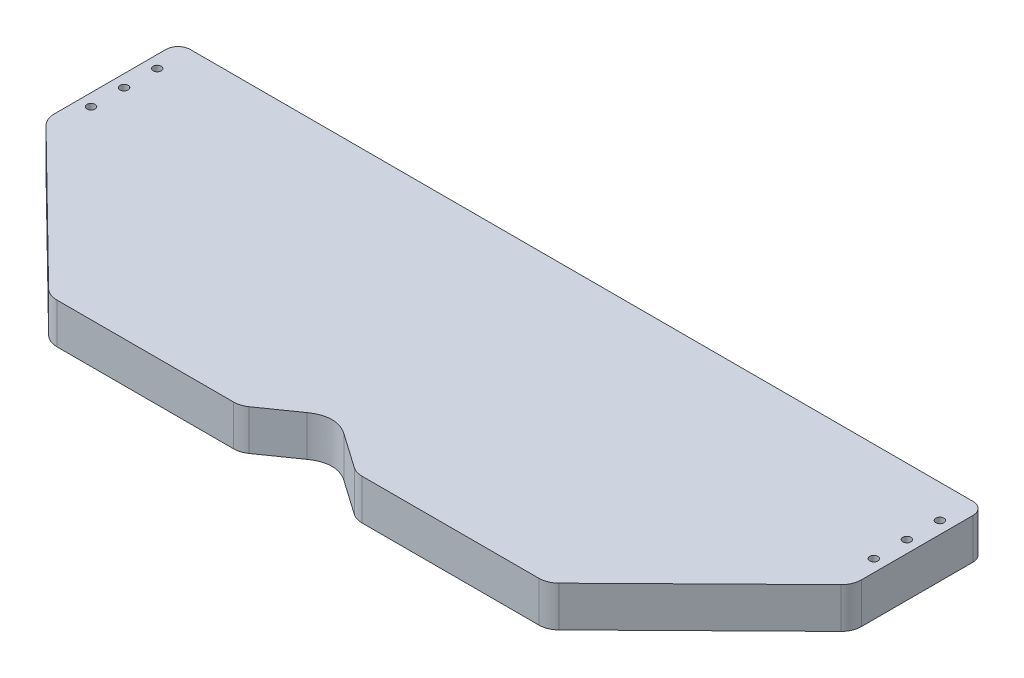
ISO-10303-21;
HEADER;
FILE_DESCRIPTION(('STEP AP214'),'2;1');
FILE_NAME('part.step','',(''),(''),'','','');
FILE_SCHEMA(('AUTOMOTIVE_DESIGN { 1 0 10303 214 1 1 1 1 }'));
ENDSEC;
DATA;
#1=APPLICATION_CONTEXT('core data for automotive mechanical design processes');
#2=APPLICATION_PROTOCOL_DEFINITION('international standard','automotive_design',2000,#1);
#3=PRODUCT_CONTEXT('',#1,'mechanical');
#4=PRODUCT('Part','Part','',(#3));
#5=PRODUCT_RELATED_PRODUCT_CATEGORY('part','',(#4));
#6=PRODUCT_DEFINITION_FORMATION('','',#4);
#7=PRODUCT_DEFINITION_CONTEXT('part definition',#1,'design');
#8=PRODUCT_DEFINITION('design','',#6,#7);
#9=PRODUCT_DEFINITION_SHAPE('','',#8);
#10=(LENGTH_UNIT() NAMED_UNIT(*) SI_UNIT(.MILLI.,.METRE.));
#11=(NAMED_UNIT(*) PLANE_ANGLE_UNIT() SI_UNIT($,.RADIAN.));
#12=(NAMED_UNIT(*) SI_UNIT($,.STERADIAN.) SOLID_ANGLE_UNIT());
#13=UNCERTAINTY_MEASURE_WITH_UNIT(LENGTH_MEASURE(1.E-05),#10,'distance_accuracy_value','');
#14=(GEOMETRIC_REPRESENTATION_CONTEXT(3) GLOBAL_UNCERTAINTY_ASSIGNED_CONTEXT((#13)) GLOBAL_UNIT_ASSIGNED_CONTEXT((#10,
#11,#12)) REPRESENTATION_CONTEXT('',''));
#15=CARTESIAN_POINT('',(0.,0.,0.));
#16=DIRECTION('',(0.,0.,1.));
#17=DIRECTION('',(1.,0.,0.));
#18=AXIS2_PLACEMENT_3D('',#15,#16,#17);
#19=CARTESIAN_POINT('',(0.,5.,0.));
#20=DIRECTION('',(0.,1.,0.));
#21=DIRECTION('',(0.,0.,1.));
#22=AXIS2_PLACEMENT_3D('',#19,#20,#21);
#23=PLANE('',#22);
#24=CARTESIAN_POINT('',(-96.5800000000001,5.,16.32));
#25=DIRECTION('',(0.,1.,0.));
#26=DIRECTION('',(0.,0.,-1.));
#27=AXIS2_PLACEMENT_3D('',#24,#25,#26);
#28=CIRCLE('',#27,0.999999999999998);
#29=CARTESIAN_POINT('',(-96.5800000000001,5.,15.32));
#30=VERTEX_POINT('',#29);
#31=EDGE_CURVE('E404',#30,#30,#28,.T.);
#32=ORIENTED_EDGE('',*,*,#31,.F.);
#33=EDGE_LOOP('',(#32));
#34=FACE_BOUND('',#33,.T.);
#35=CARTESIAN_POINT('',(96.5800000000002,5.,24.48));
#36=DIRECTION('',(0.,1.,0.));
#37=DIRECTION('',(0.,0.,1.));
#38=AXIS2_PLACEMENT_3D('',#35,#36,#37);
#39=CIRCLE('',#38,0.999999999999998);
#40=CARTESIAN_POINT('',(96.5800000000002,5.,25.48));
#41=VERTEX_POINT('',#40);
#42=EDGE_CURVE('E416',#41,#41,#39,.T.);
#43=ORIENTED_EDGE('',*,*,#42,.F.);
#44=EDGE_LOOP('',(#43));
#45=FACE_BOUND('',#44,.T.);
#46=CARTESIAN_POINT('',(96.58,5.,8.16));
#47=DIRECTION('',(0.,1.,0.));
#48=DIRECTION('',(0.,0.,1.));
#49=AXIS2_PLACEMENT_3D('',#46,#47,#48);
#50=CIRCLE('',#49,0.999999999999998);
#51=CARTESIAN_POINT('',(96.58,5.,9.16));
#52=VERTEX_POINT('',#51);
#53=EDGE_CURVE('E206',#52,#52,#50,.T.);
#54=ORIENTED_EDGE('',*,*,#53,.F.);
#55=EDGE_LOOP('',(#54));
#56=FACE_BOUND('',#55,.T.);
#57=DIRECTION('',(0.,0.,-1.));
#58=VECTOR('',#57,1.);
#59=CARTESIAN_POINT('',(99.58,5.,0.));
#60=LINE('',#59,#58);
#61=CARTESIAN_POINT('',(99.58,5.,30.5217675490164));
#62=VERTEX_POINT('',#61);
#63=CARTESIAN_POINT('',(99.58,5.,3.));
#64=VERTEX_POINT('',#63);
#65=EDGE_CURVE('E304',#62,#64,#60,.T.);
#66=ORIENTED_EDGE('',*,*,#65,.T.);
#67=CARTESIAN_POINT('',(96.58,5.,3.));
#68=DIRECTION('',(0.,1.,0.));
#69=DIRECTION('',(0.,0.,1.));
#70=AXIS2_PLACEMENT_3D('',#67,#68,#69);
#71=CIRCLE('',#70,3.);
#72=CARTESIAN_POINT('',(96.5799999999999,5.,0.));
#73=VERTEX_POINT('',#72);
#74=EDGE_CURVE('E632',#64,#73,#71,.T.);
#75=ORIENTED_EDGE('',*,*,#74,.T.);
#76=DIRECTION('',(-1.,0.,0.));
#77=VECTOR('',#76,1.);
#78=CARTESIAN_POINT('',(-99.58,5.,0.));
#79=LINE('',#78,#77);
#80=CARTESIAN_POINT('',(-96.58,5.,0.));
#81=VERTEX_POINT('',#80);
#82=EDGE_CURVE('E307',#73,#81,#79,.T.);
#83=ORIENTED_EDGE('',*,*,#82,.T.);
#84=CARTESIAN_POINT('',(-96.58,5.,3.00000000000004));
#85=DIRECTION('',(0.,1.,0.));
#86=DIRECTION('',(0.,0.,1.));
#87=AXIS2_PLACEMENT_3D('',#84,#85,#86);
#88=CIRCLE('',#87,3.);
#89=CARTESIAN_POINT('',(-99.58,5.,3.00000000000004));
#90=VERTEX_POINT('',#89);
#91=EDGE_CURVE('E627',#81,#90,#88,.T.);
#92=ORIENTED_EDGE('',*,*,#91,.T.);
#93=DIRECTION('',(0.,0.,1.));
#94=VECTOR('',#93,1.);
#95=CARTESIAN_POINT('',(-99.58,5.,32.62));
#96=LINE('',#95,#94);
#97=CARTESIAN_POINT('',(-99.58,5.,30.5217675490164));
#98=VERTEX_POINT('',#97);
#99=EDGE_CURVE('E310',#90,#98,#96,.T.);
#100=ORIENTED_EDGE('',*,*,#99,.T.);
#101=CARTESIAN_POINT('',(-94.58,5.,30.5217675490164));
#102=DIRECTION('',(0.,1.,0.));
#103=DIRECTION('',(0.,0.,1.));
#104=AXIS2_PLACEMENT_3D('',#101,#102,#103);
#105=CIRCLE('',#104,5.);
#106=CARTESIAN_POINT('',(-98.0826553773675,5.,34.0898770354809));
#107=VERTEX_POINT('',#106);
#108=EDGE_CURVE('E653',#98,#107,#105,.T.);
#109=ORIENTED_EDGE('',*,*,#108,.T.);
#110=DIRECTION('',(0.713621897292908,0.,0.700531075473508));
#111=VECTOR('',#110,1.);
#112=CARTESIAN_POINT('',(-61.5014800674211,5.,70.));
#113=LINE('',#112,#111);
#114=CARTESIAN_POINT('',(-62.960128314102,5.,68.5681094864645));
#115=VERTEX_POINT('',#114);
#116=EDGE_CURVE('E312',#107,#115,#113,.T.);
#117=ORIENTED_EDGE('',*,*,#116,.T.);
#118=CARTESIAN_POINT('',(-59.4574729367344,5.,65.));
#119=DIRECTION('',(0.,1.,0.));
#120=DIRECTION('',(0.,0.,1.));
#121=AXIS2_PLACEMENT_3D('',#118,#119,#120);
#122=CIRCLE('',#121,5.);
#123=CARTESIAN_POINT('',(-59.4574729367344,5.,70.));
#124=VERTEX_POINT('',#123);
#125=EDGE_CURVE('E686',#115,#124,#122,.T.);
#126=ORIENTED_EDGE('',*,*,#125,.T.);
#127=DIRECTION('',(1.,0.,0.));
#128=VECTOR('',#127,1.);
#129=CARTESIAN_POINT('',(-14.2814800674211,5.,70.));
#130=LINE('',#129,#128);
#131=CARTESIAN_POINT('',(-15.857974011816,5.,70.));
#132=VERTEX_POINT('',#131);
#133=EDGE_CURVE('E314',#124,#132,#130,.T.);
#134=ORIENTED_EDGE('',*,*,#133,.T.);
#135=CARTESIAN_POINT('',(-15.857974011816,5.,65.));
#136=DIRECTION('',(0.,1.,0.));
#137=DIRECTION('',(0.,0.,1.));
#138=AXIS2_PLACEMENT_3D('',#135,#136,#137);
#139=CIRCLE('',#138,5.);
#140=CARTESIAN_POINT('',(-12.9900918300608,5.,69.0957602214449));
#141=VERTEX_POINT('',#140);
#142=EDGE_CURVE('E323',#132,#141,#139,.T.);
#143=ORIENTED_EDGE('',*,*,#142,.T.);
#144=DIRECTION('',(0.819152044288991,0.,-0.573576436351047));
#145=VECTOR('',#144,1.);
#146=CARTESIAN_POINT('',(0.,5.,60.));
#147=LINE('',#146,#145);
#148=CARTESIAN_POINT('',(-4.58861149080837,5.,63.2129803557797));
#149=VERTEX_POINT('',#148);
#150=EDGE_CURVE('E193',#141,#149,#147,.T.);
#151=ORIENTED_EDGE('',*,*,#150,.T.);
#152=CARTESIAN_POINT('',(4.58861149080838,5.,63.2129803557797));
#153=CARTESIAN_POINT('',(0.,5.,60.));
#154=CARTESIAN_POINT('',(-4.58861149080837,5.,63.2129803557797));
#155=(BOUNDED_CURVE() B_SPLINE_CURVE(2,(#152,#153,#154),.UNSPECIFIED.,.F.,
.F.) B_SPLINE_CURVE_WITH_KNOTS((3,3),(0.,1.),
.UNSPECIFIED.) CURVE() GEOMETRIC_REPRESENTATION_ITEM() RATIONAL_B_SPLINE_CURVE((1.,1.,1.)) REPRESENTATION_ITEM(''));
#156=CARTESIAN_POINT('',(4.58861149080838,5.,63.2129803557797));
#157=VERTEX_POINT('',#156);
#158=EDGE_CURVE('E12',#149,#157,#155,.F.);
#159=ORIENTED_EDGE('',*,*,#158,.T.);
#160=DIRECTION('',(0.819152044288991,0.,0.573576436351047));
#161=VECTOR('',#160,1.);
#162=CARTESIAN_POINT('',(14.2814800674211,5.,70.));
#163=LINE('',#162,#161);
#164=CARTESIAN_POINT('',(12.9900918300608,5.,69.0957602214449));
#165=VERTEX_POINT('',#164);
#166=EDGE_CURVE('E228',#157,#165,#163,.T.);
#167=ORIENTED_EDGE('',*,*,#166,.T.);
#168=CARTESIAN_POINT('',(15.857974011816,5.,65.));
#169=DIRECTION('',(0.,1.,0.));
#170=DIRECTION('',(0.,0.,1.));
#171=AXIS2_PLACEMENT_3D('',#168,#169,#170);
#172=CIRCLE('',#171,5.);
#173=CARTESIAN_POINT('',(15.857974011816,5.,70.));
#174=VERTEX_POINT('',#173);
#175=EDGE_CURVE('E703',#165,#174,#172,.T.);
#176=ORIENTED_EDGE('',*,*,#175,.T.);
#177=DIRECTION('',(1.,0.,0.));
#178=VECTOR('',#177,1.);
#179=CARTESIAN_POINT('',(61.5014800674211,5.,70.));
#180=LINE('',#179,#178);
#181=CARTESIAN_POINT('',(59.4574729367344,5.,70.));
#182=VERTEX_POINT('',#181);
#183=EDGE_CURVE('E192',#174,#182,#180,.T.);
#184=ORIENTED_EDGE('',*,*,#183,.T.);
#185=CARTESIAN_POINT('',(59.4574729367344,5.,65.));
#186=DIRECTION('',(0.,1.,0.));
#187=DIRECTION('',(0.,0.,1.));
#188=AXIS2_PLACEMENT_3D('',#185,#186,#187);
#189=CIRCLE('',#188,5.);
#190=CARTESIAN_POINT('',(62.960128314102,5.,68.5681094864646));
#191=VERTEX_POINT('',#190);
#192=EDGE_CURVE('E688',#182,#191,#189,.T.);
#193=ORIENTED_EDGE('',*,*,#192,.T.);
#194=DIRECTION('',(0.713621897292908,0.,-0.700531075473508));
#195=VECTOR('',#194,1.);
#196=CARTESIAN_POINT('',(99.58,5.,32.62));
#197=LINE('',#196,#195);
#198=CARTESIAN_POINT('',(98.0826553773676,5.,34.0898770354809));
#199=VERTEX_POINT('',#198);
#200=EDGE_CURVE('E301',#191,#199,#197,.T.);
#201=ORIENTED_EDGE('',*,*,#200,.T.);
#202=CARTESIAN_POINT('',(94.58,5.,30.5217675490164));
#203=DIRECTION('',(0.,1.,0.));
#204=DIRECTION('',(0.,0.,1.));
#205=AXIS2_PLACEMENT_3D('',#202,#203,#204);
#206=CIRCLE('',#205,5.);
#207=EDGE_CURVE('E654',#199,#62,#206,.T.);
#208=ORIENTED_EDGE('',*,*,#207,.T.);
#209=EDGE_LOOP('',(#66,#75,#83,#92,#100,#109,#117,#126,#134,#143,#151,#159,#167,#176,#184,#193,
#201,#208));
#210=FACE_BOUND('',#209,.T.);
#211=CARTESIAN_POINT('',(96.5800000000001,5.,16.32));
#212=DIRECTION('',(0.,1.,0.));
#213=DIRECTION('',(0.,0.,1.));
#214=AXIS2_PLACEMENT_3D('',#211,#212,#213);
#215=CIRCLE('',#214,0.999999999999998);
#216=CARTESIAN_POINT('',(96.5800000000001,5.,17.32));
#217=VERTEX_POINT('',#216);
#218=EDGE_CURVE('E422',#217,#217,#215,.T.);
#219=ORIENTED_EDGE('',*,*,#218,.F.);
#220=EDGE_LOOP('',(#219));
#221=FACE_BOUND('',#220,.T.);
#222=CARTESIAN_POINT('',(-96.5800000000002,5.,24.48));
#223=DIRECTION('',(0.,1.,0.));
#224=DIRECTION('',(0.,0.,-1.));
#225=AXIS2_PLACEMENT_3D('',#222,#223,#224);
#226=CIRCLE('',#225,0.999999999999998);
#227=CARTESIAN_POINT('',(-96.5800000000002,5.,23.48));
#228=VERTEX_POINT('',#227);
#229=EDGE_CURVE('E410',#228,#228,#226,.T.);
#230=ORIENTED_EDGE('',*,*,#229,.F.);
#231=EDGE_LOOP('',(#230));
#232=FACE_BOUND('',#231,.T.);
#233=CARTESIAN_POINT('',(-96.58,5.,8.16));
#234=DIRECTION('',(0.,1.,0.));
#235=DIRECTION('',(0.,0.,-1.));
#236=AXIS2_PLACEMENT_3D('',#233,#234,#235);
#237=CIRCLE('',#236,0.999999999999998);
#238=CARTESIAN_POINT('',(-96.58,5.,7.16));
#239=VERTEX_POINT('',#238);
#240=EDGE_CURVE('E395',#239,#239,#237,.T.);
#241=ORIENTED_EDGE('',*,*,#240,.F.);
#242=EDGE_LOOP('',(#241));
#243=FACE_BOUND('',#242,.T.);
#244=ADVANCED_FACE('F41',(#34,#45,#56,#210,#221,#232,#243),#23,.T.);
#245=CARTESIAN_POINT('',(0.,-5.,0.));
#246=DIRECTION('',(0.,1.,0.));
#247=DIRECTION('',(0.,0.,1.));
#248=AXIS2_PLACEMENT_3D('',#245,#246,#247);
#249=PLANE('',#248);
#250=DIRECTION('',(-1.,0.,0.));
#251=VECTOR('',#250,1.);
#252=CARTESIAN_POINT('',(-99.58,-5.,0.));
#253=LINE('',#252,#251);
#254=CARTESIAN_POINT('',(96.5799999999999,-5.,0.));
#255=VERTEX_POINT('',#254);
#256=CARTESIAN_POINT('',(-96.58,-5.,0.));
#257=VERTEX_POINT('',#256);
#258=EDGE_CURVE('E214',#255,#257,#253,.T.);
#259=ORIENTED_EDGE('',*,*,#258,.F.);
#260=CARTESIAN_POINT('',(96.58,-5.,3.));
#261=DIRECTION('',(0.,1.,0.));
#262=DIRECTION('',(0.,0.,1.));
#263=AXIS2_PLACEMENT_3D('',#260,#261,#262);
#264=CIRCLE('',#263,3.);
#265=CARTESIAN_POINT('',(99.58,-5.,3.));
#266=VERTEX_POINT('',#265);
#267=EDGE_CURVE('E636',#255,#266,#264,.F.);
#268=ORIENTED_EDGE('',*,*,#267,.T.);
#269=DIRECTION('',(0.,0.,-1.));
#270=VECTOR('',#269,1.);
#271=CARTESIAN_POINT('',(99.58,-5.,0.));
#272=LINE('',#271,#270);
#273=CARTESIAN_POINT('',(99.58,-5.,30.5217675490164));
#274=VERTEX_POINT('',#273);
#275=EDGE_CURVE('E204',#274,#266,#272,.T.);
#276=ORIENTED_EDGE('',*,*,#275,.F.);
#277=CARTESIAN_POINT('',(94.58,-5.,30.5217675490164));
#278=DIRECTION('',(0.,1.,0.));
#279=DIRECTION('',(0.,0.,1.));
#280=AXIS2_PLACEMENT_3D('',#277,#278,#279);
#281=CIRCLE('',#280,5.);
#282=CARTESIAN_POINT('',(98.0826553773676,-5.,34.0898770354809));
#283=VERTEX_POINT('',#282);
#284=EDGE_CURVE('E650',#274,#283,#281,.F.);
#285=ORIENTED_EDGE('',*,*,#284,.T.);
#286=DIRECTION('',(0.713621897292908,0.,-0.700531075473508));
#287=VECTOR('',#286,1.);
#288=CARTESIAN_POINT('',(99.58,-5.,32.62));
#289=LINE('',#288,#287);
#290=CARTESIAN_POINT('',(62.960128314102,-5.,68.5681094864646));
#291=VERTEX_POINT('',#290);
#292=EDGE_CURVE('E200',#291,#283,#289,.T.);
#293=ORIENTED_EDGE('',*,*,#292,.F.);
#294=CARTESIAN_POINT('',(59.4574729367344,-5.,65.));
#295=DIRECTION('',(0.,1.,0.));
#296=DIRECTION('',(0.,0.,1.));
#297=AXIS2_PLACEMENT_3D('',#294,#295,#296);
#298=CIRCLE('',#297,5.);
#299=CARTESIAN_POINT('',(59.4574729367344,-5.,70.));
#300=VERTEX_POINT('',#299);
#301=EDGE_CURVE('E199',#291,#300,#298,.F.);
#302=ORIENTED_EDGE('',*,*,#301,.T.);
#303=DIRECTION('',(1.,0.,0.));
#304=VECTOR('',#303,1.);
#305=CARTESIAN_POINT('',(61.5014800674211,-5.,70.));
#306=LINE('',#305,#304);
#307=CARTESIAN_POINT('',(15.857974011816,-5.,70.));
#308=VERTEX_POINT('',#307);
#309=EDGE_CURVE('E189',#308,#300,#306,.T.);
#310=ORIENTED_EDGE('',*,*,#309,.F.);
#311=CARTESIAN_POINT('',(15.857974011816,-5.,65.));
#312=DIRECTION('',(0.,1.,0.));
#313=DIRECTION('',(0.,0.,1.));
#314=AXIS2_PLACEMENT_3D('',#311,#312,#313);
#315=CIRCLE('',#314,5.);
#316=CARTESIAN_POINT('',(12.9900918300608,-5.,69.0957602214449));
#317=VERTEX_POINT('',#316);
#318=EDGE_CURVE('E175',#308,#317,#315,.F.);
#319=ORIENTED_EDGE('',*,*,#318,.T.);
#320=DIRECTION('',(0.819152044288991,0.,0.573576436351047));
#321=VECTOR('',#320,1.);
#322=CARTESIAN_POINT('',(14.2814800674211,-5.,70.));
#323=LINE('',#322,#321);
#324=CARTESIAN_POINT('',(4.58861149080838,-5.,63.2129803557797));
#325=VERTEX_POINT('',#324);
#326=EDGE_CURVE('E201',#325,#317,#323,.T.);
#327=ORIENTED_EDGE('',*,*,#326,.F.);
#328=CARTESIAN_POINT('',(-4.58861149080837,-5.,63.2129803557797));
#329=CARTESIAN_POINT('',(0.,-5.,60.));
#330=CARTESIAN_POINT('',(4.58861149080838,-5.,63.2129803557797));
#331=(BOUNDED_CURVE() B_SPLINE_CURVE(2,(#328,#329,#330),.UNSPECIFIED.,.F.,
.F.) B_SPLINE_CURVE_WITH_KNOTS((3,3),(0.,1.),
.UNSPECIFIED.) CURVE() GEOMETRIC_REPRESENTATION_ITEM() RATIONAL_B_SPLINE_CURVE((1.,1.,1.)) REPRESENTATION_ITEM(''));
#332=CARTESIAN_POINT('',(-4.58861149080837,-5.,63.2129803557797));
#333=VERTEX_POINT('',#332);
#334=EDGE_CURVE('E55',#325,#333,#331,.F.);
#335=ORIENTED_EDGE('',*,*,#334,.T.);
#336=DIRECTION('',(0.819152044288991,0.,-0.573576436351047));
#337=VECTOR('',#336,1.);
#338=CARTESIAN_POINT('',(0.,-5.,60.));
#339=LINE('',#338,#337);
#340=CARTESIAN_POINT('',(-12.9900918300608,-5.,69.0957602214449));
#341=VERTEX_POINT('',#340);
#342=EDGE_CURVE('E223',#341,#333,#339,.T.);
#343=ORIENTED_EDGE('',*,*,#342,.F.);
#344=CARTESIAN_POINT('',(-15.857974011816,-5.,65.));
#345=DIRECTION('',(0.,1.,0.));
#346=DIRECTION('',(0.,0.,1.));
#347=AXIS2_PLACEMENT_3D('',#344,#345,#346);
#348=CIRCLE('',#347,5.);
#349=CARTESIAN_POINT('',(-15.857974011816,-5.,70.));
#350=VERTEX_POINT('',#349);
#351=EDGE_CURVE('E183',#341,#350,#348,.F.);
#352=ORIENTED_EDGE('',*,*,#351,.T.);
#353=DIRECTION('',(1.,0.,0.));
#354=VECTOR('',#353,1.);
#355=CARTESIAN_POINT('',(-14.2814800674211,-5.,70.));
#356=LINE('',#355,#354);
#357=CARTESIAN_POINT('',(-59.4574729367344,-5.,70.));
#358=VERTEX_POINT('',#357);
#359=EDGE_CURVE('E221',#358,#350,#356,.T.);
#360=ORIENTED_EDGE('',*,*,#359,.F.);
#361=CARTESIAN_POINT('',(-59.4574729367344,-5.,65.));
#362=DIRECTION('',(0.,1.,0.));
#363=DIRECTION('',(0.,0.,1.));
#364=AXIS2_PLACEMENT_3D('',#361,#362,#363);
#365=CIRCLE('',#364,5.);
#366=CARTESIAN_POINT('',(-62.960128314102,-5.,68.5681094864645));
#367=VERTEX_POINT('',#366);
#368=EDGE_CURVE('E693',#358,#367,#365,.F.);
#369=ORIENTED_EDGE('',*,*,#368,.T.);
#370=DIRECTION('',(0.713621897292908,0.,0.700531075473508));
#371=VECTOR('',#370,1.);
#372=CARTESIAN_POINT('',(-61.5014800674211,-5.,70.));
#373=LINE('',#372,#371);
#374=CARTESIAN_POINT('',(-98.0826553773675,-5.,34.0898770354809));
#375=VERTEX_POINT('',#374);
#376=EDGE_CURVE('E219',#375,#367,#373,.T.);
#377=ORIENTED_EDGE('',*,*,#376,.F.);
#378=CARTESIAN_POINT('',(-94.58,-5.,30.5217675490164));
#379=DIRECTION('',(0.,1.,0.));
#380=DIRECTION('',(0.,0.,1.));
#381=AXIS2_PLACEMENT_3D('',#378,#379,#380);
#382=CIRCLE('',#381,5.);
#383=CARTESIAN_POINT('',(-99.58,-5.,30.5217675490164));
#384=VERTEX_POINT('',#383);
#385=EDGE_CURVE('E644',#375,#384,#382,.F.);
#386=ORIENTED_EDGE('',*,*,#385,.T.);
#387=DIRECTION('',(0.,0.,1.));
#388=VECTOR('',#387,1.);
#389=CARTESIAN_POINT('',(-99.58,-5.,32.62));
#390=LINE('',#389,#388);
#391=CARTESIAN_POINT('',(-99.58,-5.,3.00000000000004));
#392=VERTEX_POINT('',#391);
#393=EDGE_CURVE('E217',#392,#384,#390,.T.);
#394=ORIENTED_EDGE('',*,*,#393,.F.);
#395=CARTESIAN_POINT('',(-96.58,-5.,3.00000000000004));
#396=DIRECTION('',(0.,1.,0.));
#397=DIRECTION('',(0.,0.,1.));
#398=AXIS2_PLACEMENT_3D('',#395,#396,#397);
#399=CIRCLE('',#398,3.);
#400=EDGE_CURVE('E642',#392,#257,#399,.F.);
#401=ORIENTED_EDGE('',*,*,#400,.T.);
#402=EDGE_LOOP('',(#259,#268,#276,#285,#293,#302,#310,#319,#327,#335,#343,#352,#360,#369,#377,
#386,#394,#401));
#403=FACE_BOUND('',#402,.T.);
#404=CARTESIAN_POINT('',(96.58,-5.,8.16));
#405=DIRECTION('',(0.,1.,0.));
#406=DIRECTION('',(0.,0.,1.));
#407=AXIS2_PLACEMENT_3D('',#404,#405,#406);
#408=CIRCLE('',#407,0.999999999999998);
#409=CARTESIAN_POINT('',(96.58,-5.,9.16));
#410=VERTEX_POINT('',#409);
#411=EDGE_CURVE('E298',#410,#410,#408,.T.);
#412=ORIENTED_EDGE('',*,*,#411,.T.);
#413=EDGE_LOOP('',(#412));
#414=FACE_BOUND('',#413,.T.);
#415=CARTESIAN_POINT('',(96.5800000000001,-5.,16.32));
#416=DIRECTION('',(0.,1.,0.));
#417=DIRECTION('',(0.,0.,1.));
#418=AXIS2_PLACEMENT_3D('',#415,#416,#417);
#419=CIRCLE('',#418,0.999999999999998);
#420=CARTESIAN_POINT('',(96.5800000000001,-5.,17.32));
#421=VERTEX_POINT('',#420);
#422=EDGE_CURVE('E419',#421,#421,#419,.T.);
#423=ORIENTED_EDGE('',*,*,#422,.T.);
#424=EDGE_LOOP('',(#423));
#425=FACE_BOUND('',#424,.T.);
#426=CARTESIAN_POINT('',(96.5800000000002,-5.,24.48));
#427=DIRECTION('',(0.,1.,0.));
#428=DIRECTION('',(0.,0.,1.));
#429=AXIS2_PLACEMENT_3D('',#426,#427,#428);
#430=CIRCLE('',#429,0.999999999999998);
#431=CARTESIAN_POINT('',(96.5800000000002,-5.,25.48));
#432=VERTEX_POINT('',#431);
#433=EDGE_CURVE('E413',#432,#432,#430,.T.);
#434=ORIENTED_EDGE('',*,*,#433,.T.);
#435=EDGE_LOOP('',(#434));
#436=FACE_BOUND('',#435,.T.);
#437=CARTESIAN_POINT('',(-96.5800000000002,-5.,24.48));
#438=DIRECTION('',(0.,1.,0.));
#439=DIRECTION('',(0.,0.,-1.));
#440=AXIS2_PLACEMENT_3D('',#437,#438,#439);
#441=CIRCLE('',#440,0.999999999999998);
#442=CARTESIAN_POINT('',(-96.5800000000002,-5.,23.48));
#443=VERTEX_POINT('',#442);
#444=EDGE_CURVE('E407',#443,#443,#441,.T.);
#445=ORIENTED_EDGE('',*,*,#444,.T.);
#446=EDGE_LOOP('',(#445));
#447=FACE_BOUND('',#446,.T.);
#448=CARTESIAN_POINT('',(-96.5800000000001,-5.,16.32));
#449=DIRECTION('',(0.,1.,0.));
#450=DIRECTION('',(0.,0.,-1.));
#451=AXIS2_PLACEMENT_3D('',#448,#449,#450);
#452=CIRCLE('',#451,0.999999999999998);
#453=CARTESIAN_POINT('',(-96.5800000000001,-5.,15.32));
#454=VERTEX_POINT('',#453);
#455=EDGE_CURVE('E401',#454,#454,#452,.T.);
#456=ORIENTED_EDGE('',*,*,#455,.T.);
#457=EDGE_LOOP('',(#456));
#458=FACE_BOUND('',#457,.T.);
#459=CARTESIAN_POINT('',(-96.58,-5.,8.16));
#460=DIRECTION('',(0.,1.,0.));
#461=DIRECTION('',(0.,0.,-1.));
#462=AXIS2_PLACEMENT_3D('',#459,#460,#461);
#463=CIRCLE('',#462,0.999999999999998);
#464=CARTESIAN_POINT('',(-96.58,-5.,7.16));
#465=VERTEX_POINT('',#464);
#466=EDGE_CURVE('E398',#465,#465,#463,.T.);
#467=ORIENTED_EDGE('',*,*,#466,.T.);
#468=EDGE_LOOP('',(#467));
#469=FACE_BOUND('',#468,.T.);
#470=ADVANCED_FACE('F196',(#403,#414,#425,#436,#447,#458,#469),#249,.F.);
#471=CARTESIAN_POINT('',(14.2814800674211,5.,70.));
#472=DIRECTION('',(0.573576436351047,0.,-0.819152044288991));
#473=DIRECTION('',(-0.819152044288991,0.,-0.573576436351047));
#474=AXIS2_PLACEMENT_3D('',#471,#472,#473);
#475=PLANE('',#474);
#476=ORIENTED_EDGE('',*,*,#166,.F.);
#477=CARTESIAN_POINT('',(4.58861149080838,-5.5,63.2129803557797));
#478=CARTESIAN_POINT('',(4.58861149080838,-1.83333333333334,63.2129803557797));
#479=CARTESIAN_POINT('',(4.58861149080838,1.83333333333334,63.2129803557797));
#480=CARTESIAN_POINT('',(4.58861149080838,5.5,63.2129803557797));
#481=(BOUNDED_CURVE() B_SPLINE_CURVE(3,(#477,#478,#479,#480),.UNSPECIFIED.,.F.,
.F.) B_SPLINE_CURVE_WITH_KNOTS((4,4),(-0.0105,0.0005),
.UNSPECIFIED.) CURVE() GEOMETRIC_REPRESENTATION_ITEM() RATIONAL_B_SPLINE_CURVE((1.,1.,1.,1.)) REPRESENTATION_ITEM(''));
#482=EDGE_CURVE('E292',#157,#325,#481,.F.);
#483=ORIENTED_EDGE('',*,*,#482,.T.);
#484=ORIENTED_EDGE('',*,*,#326,.T.);
#485=DIRECTION('',(0.,-1.,0.));
#486=VECTOR('',#485,1.);
#487=CARTESIAN_POINT('',(12.9900918300608,5.,69.0957602214449));
#488=LINE('',#487,#486);
#489=EDGE_CURVE('E181',#317,#165,#488,.F.);
#490=ORIENTED_EDGE('',*,*,#489,.T.);
#491=EDGE_LOOP('',(#476,#483,#484,#490));
#492=FACE_BOUND('',#491,.T.);
#493=ADVANCED_FACE('F274',(#492),#475,.F.);
#494=CARTESIAN_POINT('',(61.5014800674211,5.,70.));
#495=DIRECTION('',(0.,0.,-1.));
#496=DIRECTION('',(-1.,0.,0.));
#497=AXIS2_PLACEMENT_3D('',#494,#495,#496);
#498=PLANE('',#497);
#499=ORIENTED_EDGE('',*,*,#309,.T.);
#500=DIRECTION('',(0.,-1.,0.));
#501=VECTOR('',#500,1.);
#502=CARTESIAN_POINT('',(59.4574729367344,5.,70.));
#503=LINE('',#502,#501);
#504=EDGE_CURVE('E679',#300,#182,#503,.F.);
#505=ORIENTED_EDGE('',*,*,#504,.T.);
#506=ORIENTED_EDGE('',*,*,#183,.F.);
#507=DIRECTION('',(0.,-1.,0.));
#508=VECTOR('',#507,1.);
#509=CARTESIAN_POINT('',(15.857974011816,5.,70.));
#510=LINE('',#509,#508);
#511=EDGE_CURVE('E179',#174,#308,#510,.T.);
#512=ORIENTED_EDGE('',*,*,#511,.T.);
#513=EDGE_LOOP('',(#499,#505,#506,#512));
#514=FACE_BOUND('',#513,.T.);
#515=ADVANCED_FACE('F188',(#514),#498,.F.);
#516=CARTESIAN_POINT('',(99.58,5.,32.62));
#517=DIRECTION('',(-0.700531075473508,0.,-0.713621897292908));
#518=DIRECTION('',(-0.713621897292908,0.,0.700531075473508));
#519=AXIS2_PLACEMENT_3D('',#516,#517,#518);
#520=PLANE('',#519);
#521=ORIENTED_EDGE('',*,*,#292,.T.);
#522=DIRECTION('',(0.,-1.,0.));
#523=VECTOR('',#522,1.);
#524=CARTESIAN_POINT('',(98.0826553773676,5.,34.0898770354809));
#525=LINE('',#524,#523);
#526=EDGE_CURVE('E663',#283,#199,#525,.F.);
#527=ORIENTED_EDGE('',*,*,#526,.T.);
#528=ORIENTED_EDGE('',*,*,#200,.F.);
#529=DIRECTION('',(0.,-1.,0.));
#530=VECTOR('',#529,1.);
#531=CARTESIAN_POINT('',(62.960128314102,5.,68.5681094864646));
#532=LINE('',#531,#530);
#533=EDGE_CURVE('E683',#191,#291,#532,.T.);
#534=ORIENTED_EDGE('',*,*,#533,.T.);
#535=EDGE_LOOP('',(#521,#527,#528,#534));
#536=FACE_BOUND('',#535,.T.);
#537=ADVANCED_FACE('F267',(#536),#520,.F.);
#538=CARTESIAN_POINT('',(99.58,5.,0.));
#539=DIRECTION('',(-1.,0.,0.));
#540=DIRECTION('',(0.,0.,1.));
#541=AXIS2_PLACEMENT_3D('',#538,#539,#540);
#542=PLANE('',#541);
#543=ORIENTED_EDGE('',*,*,#275,.T.);
#544=DIRECTION('',(0.,-1.,0.));
#545=VECTOR('',#544,1.);
#546=CARTESIAN_POINT('',(99.58,5.,3.));
#547=LINE('',#546,#545);
#548=EDGE_CURVE('E633',#266,#64,#547,.F.);
#549=ORIENTED_EDGE('',*,*,#548,.T.);
#550=ORIENTED_EDGE('',*,*,#65,.F.);
#551=DIRECTION('',(0.,-1.,0.));
#552=VECTOR('',#551,1.);
#553=CARTESIAN_POINT('',(99.58,5.,30.5217675490164));
#554=LINE('',#553,#552);
#555=EDGE_CURVE('E660',#62,#274,#554,.T.);
#556=ORIENTED_EDGE('',*,*,#555,.T.);
#557=EDGE_LOOP('',(#543,#549,#550,#556));
#558=FACE_BOUND('',#557,.T.);
#559=ADVANCED_FACE('F263',(#558),#542,.F.);
#560=CARTESIAN_POINT('',(-99.58,5.,0.));
#561=DIRECTION('',(0.,0.,1.));
#562=DIRECTION('',(1.,0.,0.));
#563=AXIS2_PLACEMENT_3D('',#560,#561,#562);
#564=PLANE('',#563);
#565=ORIENTED_EDGE('',*,*,#82,.F.);
#566=DIRECTION('',(0.,-1.,0.));
#567=VECTOR('',#566,1.);
#568=CARTESIAN_POINT('',(96.58,5.,0.));
#569=LINE('',#568,#567);
#570=EDGE_CURVE('E666',#73,#255,#569,.T.);
#571=ORIENTED_EDGE('',*,*,#570,.T.);
#572=ORIENTED_EDGE('',*,*,#258,.T.);
#573=DIRECTION('',(0.,-1.,0.));
#574=VECTOR('',#573,1.);
#575=CARTESIAN_POINT('',(-96.58,5.,0.));
#576=LINE('',#575,#574);
#577=EDGE_CURVE('E628',#257,#81,#576,.F.);
#578=ORIENTED_EDGE('',*,*,#577,.T.);
#579=EDGE_LOOP('',(#565,#571,#572,#578));
#580=FACE_BOUND('',#579,.T.);
#581=ADVANCED_FACE('F259',(#580),#564,.F.);
#582=CARTESIAN_POINT('',(-99.58,5.,32.62));
#583=DIRECTION('',(1.,0.,0.));
#584=DIRECTION('',(0.,0.,-1.));
#585=AXIS2_PLACEMENT_3D('',#582,#583,#584);
#586=PLANE('',#585);
#587=ORIENTED_EDGE('',*,*,#99,.F.);
#588=DIRECTION('',(0.,-1.,0.));
#589=VECTOR('',#588,1.);
#590=CARTESIAN_POINT('',(-99.58,5.,3.00000000000004));
#591=LINE('',#590,#589);
#592=EDGE_CURVE('E630',#90,#392,#591,.T.);
#593=ORIENTED_EDGE('',*,*,#592,.T.);
#594=ORIENTED_EDGE('',*,*,#393,.T.);
#595=DIRECTION('',(0.,-1.,0.));
#596=VECTOR('',#595,1.);
#597=CARTESIAN_POINT('',(-99.58,5.,30.5217675490164));
#598=LINE('',#597,#596);
#599=EDGE_CURVE('E649',#384,#98,#598,.F.);
#600=ORIENTED_EDGE('',*,*,#599,.T.);
#601=EDGE_LOOP('',(#587,#593,#594,#600));
#602=FACE_BOUND('',#601,.T.);
#603=ADVANCED_FACE('F255',(#602),#586,.F.);
#604=CARTESIAN_POINT('',(-61.5014800674211,5.,70.));
#605=DIRECTION('',(0.700531075473508,0.,-0.713621897292908));
#606=DIRECTION('',(-0.713621897292908,0.,-0.700531075473508));
#607=AXIS2_PLACEMENT_3D('',#604,#605,#606);
#608=PLANE('',#607);
#609=ORIENTED_EDGE('',*,*,#116,.F.);
#610=DIRECTION('',(0.,-1.,0.));
#611=VECTOR('',#610,1.);
#612=CARTESIAN_POINT('',(-98.0826553773675,5.,34.0898770354809));
#613=LINE('',#612,#611);
#614=EDGE_CURVE('E678',#107,#375,#613,.T.);
#615=ORIENTED_EDGE('',*,*,#614,.T.);
#616=ORIENTED_EDGE('',*,*,#376,.T.);
#617=DIRECTION('',(0.,-1.,0.));
#618=VECTOR('',#617,1.);
#619=CARTESIAN_POINT('',(-62.960128314102,5.,68.5681094864645));
#620=LINE('',#619,#618);
#621=EDGE_CURVE('E690',#367,#115,#620,.F.);
#622=ORIENTED_EDGE('',*,*,#621,.T.);
#623=EDGE_LOOP('',(#609,#615,#616,#622));
#624=FACE_BOUND('',#623,.T.);
#625=ADVANCED_FACE('F251',(#624),#608,.F.);
#626=CARTESIAN_POINT('',(-14.2814800674211,5.,70.));
#627=DIRECTION('',(0.,0.,-1.));
#628=DIRECTION('',(-1.,0.,0.));
#629=AXIS2_PLACEMENT_3D('',#626,#627,#628);
#630=PLANE('',#629);
#631=ORIENTED_EDGE('',*,*,#133,.F.);
#632=DIRECTION('',(0.,-1.,0.));
#633=VECTOR('',#632,1.);
#634=CARTESIAN_POINT('',(-59.4574729367344,5.,70.));
#635=LINE('',#634,#633);
#636=EDGE_CURVE('E696',#124,#358,#635,.T.);
#637=ORIENTED_EDGE('',*,*,#636,.T.);
#638=ORIENTED_EDGE('',*,*,#359,.T.);
#639=DIRECTION('',(0.,-1.,0.));
#640=VECTOR('',#639,1.);
#641=CARTESIAN_POINT('',(-15.857974011816,5.,70.));
#642=LINE('',#641,#640);
#643=EDGE_CURVE('E699',#350,#132,#642,.F.);
#644=ORIENTED_EDGE('',*,*,#643,.T.);
#645=EDGE_LOOP('',(#631,#637,#638,#644));
#646=FACE_BOUND('',#645,.T.);
#647=ADVANCED_FACE('F246',(#646),#630,.F.);
#648=CARTESIAN_POINT('',(0.,5.,60.));
#649=DIRECTION('',(-0.573576436351047,0.,-0.819152044288991));
#650=DIRECTION('',(-0.819152044288991,0.,0.573576436351047));
#651=AXIS2_PLACEMENT_3D('',#648,#649,#650);
#652=PLANE('',#651);
#653=ORIENTED_EDGE('',*,*,#342,.T.);
#654=CARTESIAN_POINT('',(-4.58861149080837,5.5,63.2129803557797));
#655=CARTESIAN_POINT('',(-4.58861149080837,1.83333333333334,63.2129803557797));
#656=CARTESIAN_POINT('',(-4.58861149080837,-1.83333333333334,63.2129803557797));
#657=CARTESIAN_POINT('',(-4.58861149080837,-5.5,63.2129803557797));
#658=(BOUNDED_CURVE() B_SPLINE_CURVE(3,(#654,#655,#656,#657),.UNSPECIFIED.,.F.,
.F.) B_SPLINE_CURVE_WITH_KNOTS((4,4),(-0.0105,0.0005),
.UNSPECIFIED.) CURVE() GEOMETRIC_REPRESENTATION_ITEM() RATIONAL_B_SPLINE_CURVE((1.,1.,1.,1.)) REPRESENTATION_ITEM(''));
#659=EDGE_CURVE('E69',#333,#149,#658,.F.);
#660=ORIENTED_EDGE('',*,*,#659,.T.);
#661=ORIENTED_EDGE('',*,*,#150,.F.);
#662=DIRECTION('',(0.,-1.,0.));
#663=VECTOR('',#662,1.);
#664=CARTESIAN_POINT('',(-12.9900918300608,5.,69.0957602214449));
#665=LINE('',#664,#663);
#666=EDGE_CURVE('E701',#141,#341,#665,.T.);
#667=ORIENTED_EDGE('',*,*,#666,.T.);
#668=EDGE_LOOP('',(#653,#660,#661,#667));
#669=FACE_BOUND('',#668,.T.);
#670=ADVANCED_FACE('F235',(#669),#652,.F.);
#671=CARTESIAN_POINT('',(96.58,5.,8.16));
#672=DIRECTION('',(0.,-1.,0.));
#673=DIRECTION('',(0.,0.,-1.));
#674=AXIS2_PLACEMENT_3D('',#671,#672,#673);
#675=CYLINDRICAL_SURFACE('',#674,0.999999999999998);
#676=ORIENTED_EDGE('',*,*,#53,.T.);
#677=EDGE_LOOP('',(#676));
#678=FACE_BOUND('',#677,.T.);
#679=ORIENTED_EDGE('',*,*,#411,.F.);
#680=EDGE_LOOP('',(#679));
#681=FACE_BOUND('',#680,.T.);
#682=ADVANCED_FACE('F245',(#678,#681),#675,.F.);
#683=CARTESIAN_POINT('',(96.5800000000001,5.,16.32));
#684=DIRECTION('',(0.,-1.,0.));
#685=DIRECTION('',(0.,0.,-1.));
#686=AXIS2_PLACEMENT_3D('',#683,#684,#685);
#687=CYLINDRICAL_SURFACE('',#686,0.999999999999998);
#688=ORIENTED_EDGE('',*,*,#218,.T.);
#689=EDGE_LOOP('',(#688));
#690=FACE_BOUND('',#689,.T.);
#691=ORIENTED_EDGE('',*,*,#422,.F.);
#692=EDGE_LOOP('',(#691));
#693=FACE_BOUND('',#692,.T.);
#694=ADVANCED_FACE('F368',(#690,#693),#687,.F.);
#695=CARTESIAN_POINT('',(96.5800000000002,5.,24.48));
#696=DIRECTION('',(0.,-1.,0.));
#697=DIRECTION('',(0.,0.,-1.));
#698=AXIS2_PLACEMENT_3D('',#695,#696,#697);
#699=CYLINDRICAL_SURFACE('',#698,0.999999999999998);
#700=ORIENTED_EDGE('',*,*,#42,.T.);
#701=EDGE_LOOP('',(#700));
#702=FACE_BOUND('',#701,.T.);
#703=ORIENTED_EDGE('',*,*,#433,.F.);
#704=EDGE_LOOP('',(#703));
#705=FACE_BOUND('',#704,.T.);
#706=ADVANCED_FACE('F372',(#702,#705),#699,.F.);
#707=CARTESIAN_POINT('',(-96.5800000000002,5.,24.48));
#708=DIRECTION('',(0.,-1.,0.));
#709=DIRECTION('',(0.,0.,-1.));
#710=AXIS2_PLACEMENT_3D('',#707,#708,#709);
#711=CYLINDRICAL_SURFACE('',#710,0.999999999999998);
#712=ORIENTED_EDGE('',*,*,#229,.T.);
#713=EDGE_LOOP('',(#712));
#714=FACE_BOUND('',#713,.T.);
#715=ORIENTED_EDGE('',*,*,#444,.F.);
#716=EDGE_LOOP('',(#715));
#717=FACE_BOUND('',#716,.T.);
#718=ADVANCED_FACE('F376',(#714,#717),#711,.F.);
#719=CARTESIAN_POINT('',(-96.5800000000001,5.,16.32));
#720=DIRECTION('',(0.,-1.,0.));
#721=DIRECTION('',(0.,0.,-1.));
#722=AXIS2_PLACEMENT_3D('',#719,#720,#721);
#723=CYLINDRICAL_SURFACE('',#722,0.999999999999998);
#724=ORIENTED_EDGE('',*,*,#31,.T.);
#725=EDGE_LOOP('',(#724));
#726=FACE_BOUND('',#725,.T.);
#727=ORIENTED_EDGE('',*,*,#455,.F.);
#728=EDGE_LOOP('',(#727));
#729=FACE_BOUND('',#728,.T.);
#730=ADVANCED_FACE('F380',(#726,#729),#723,.F.);
#731=CARTESIAN_POINT('',(-96.58,5.,8.16));
#732=DIRECTION('',(0.,-1.,0.));
#733=DIRECTION('',(0.,0.,-1.));
#734=AXIS2_PLACEMENT_3D('',#731,#732,#733);
#735=CYLINDRICAL_SURFACE('',#734,0.999999999999998);
#736=ORIENTED_EDGE('',*,*,#240,.T.);
#737=EDGE_LOOP('',(#736));
#738=FACE_BOUND('',#737,.T.);
#739=ORIENTED_EDGE('',*,*,#466,.F.);
#740=EDGE_LOOP('',(#739));
#741=FACE_BOUND('',#740,.T.);
#742=ADVANCED_FACE('F384',(#738,#741),#735,.F.);
#743=CARTESIAN_POINT('',(15.857974011816,5.,65.));
#744=DIRECTION('',(0.,-1.,0.));
#745=DIRECTION('',(0.,0.,-1.));
#746=AXIS2_PLACEMENT_3D('',#743,#744,#745);
#747=CYLINDRICAL_SURFACE('',#746,5.);
#748=ORIENTED_EDGE('',*,*,#175,.F.);
#749=ORIENTED_EDGE('',*,*,#489,.F.);
#750=ORIENTED_EDGE('',*,*,#318,.F.);
#751=ORIENTED_EDGE('',*,*,#511,.F.);
#752=EDGE_LOOP('',(#748,#749,#750,#751));
#753=FACE_BOUND('',#752,.T.);
#754=ADVANCED_FACE('F178',(#753),#747,.T.);
#755=CARTESIAN_POINT('',(-15.857974011816,5.,65.));
#756=DIRECTION('',(0.,-1.,0.));
#757=DIRECTION('',(0.,0.,-1.));
#758=AXIS2_PLACEMENT_3D('',#755,#756,#757);
#759=CYLINDRICAL_SURFACE('',#758,5.);
#760=ORIENTED_EDGE('',*,*,#142,.F.);
#761=ORIENTED_EDGE('',*,*,#643,.F.);
#762=ORIENTED_EDGE('',*,*,#351,.F.);
#763=ORIENTED_EDGE('',*,*,#666,.F.);
#764=EDGE_LOOP('',(#760,#761,#762,#763));
#765=FACE_BOUND('',#764,.T.);
#766=ADVANCED_FACE('F391',(#765),#759,.T.);
#767=CARTESIAN_POINT('',(-59.4574729367344,5.,65.));
#768=DIRECTION('',(0.,-1.,0.));
#769=DIRECTION('',(0.,0.,-1.));
#770=AXIS2_PLACEMENT_3D('',#767,#768,#769);
#771=CYLINDRICAL_SURFACE('',#770,5.);
#772=ORIENTED_EDGE('',*,*,#125,.F.);
#773=ORIENTED_EDGE('',*,*,#621,.F.);
#774=ORIENTED_EDGE('',*,*,#368,.F.);
#775=ORIENTED_EDGE('',*,*,#636,.F.);
#776=EDGE_LOOP('',(#772,#773,#774,#775));
#777=FACE_BOUND('',#776,.T.);
#778=ADVANCED_FACE('F528',(#777),#771,.T.);
#779=CARTESIAN_POINT('',(59.4574729367344,5.,65.));
#780=DIRECTION('',(0.,-1.,0.));
#781=DIRECTION('',(0.,0.,-1.));
#782=AXIS2_PLACEMENT_3D('',#779,#780,#781);
#783=CYLINDRICAL_SURFACE('',#782,5.);
#784=ORIENTED_EDGE('',*,*,#192,.F.);
#785=ORIENTED_EDGE('',*,*,#504,.F.);
#786=ORIENTED_EDGE('',*,*,#301,.F.);
#787=ORIENTED_EDGE('',*,*,#533,.F.);
#788=EDGE_LOOP('',(#784,#785,#786,#787));
#789=FACE_BOUND('',#788,.T.);
#790=ADVANCED_FACE('F537',(#789),#783,.T.);
#791=CARTESIAN_POINT('',(-94.58,5.,30.5217675490164));
#792=DIRECTION('',(0.,-1.,0.));
#793=DIRECTION('',(0.,0.,-1.));
#794=AXIS2_PLACEMENT_3D('',#791,#792,#793);
#795=CYLINDRICAL_SURFACE('',#794,5.);
#796=ORIENTED_EDGE('',*,*,#108,.F.);
#797=ORIENTED_EDGE('',*,*,#599,.F.);
#798=ORIENTED_EDGE('',*,*,#385,.F.);
#799=ORIENTED_EDGE('',*,*,#614,.F.);
#800=EDGE_LOOP('',(#796,#797,#798,#799));
#801=FACE_BOUND('',#800,.T.);
#802=ADVANCED_FACE('F543',(#801),#795,.T.);
#803=CARTESIAN_POINT('',(94.58,5.,30.5217675490164));
#804=DIRECTION('',(0.,-1.,0.));
#805=DIRECTION('',(0.,0.,-1.));
#806=AXIS2_PLACEMENT_3D('',#803,#804,#805);
#807=CYLINDRICAL_SURFACE('',#806,5.);
#808=ORIENTED_EDGE('',*,*,#207,.F.);
#809=ORIENTED_EDGE('',*,*,#526,.F.);
#810=ORIENTED_EDGE('',*,*,#284,.F.);
#811=ORIENTED_EDGE('',*,*,#555,.F.);
#812=EDGE_LOOP('',(#808,#809,#810,#811));
#813=FACE_BOUND('',#812,.T.);
#814=ADVANCED_FACE('F550',(#813),#807,.T.);
#815=CARTESIAN_POINT('',(96.58,5.,3.));
#816=DIRECTION('',(0.,-1.,0.));
#817=DIRECTION('',(0.,0.,-1.));
#818=AXIS2_PLACEMENT_3D('',#815,#816,#817);
#819=CYLINDRICAL_SURFACE('',#818,3.);
#820=ORIENTED_EDGE('',*,*,#74,.F.);
#821=ORIENTED_EDGE('',*,*,#548,.F.);
#822=ORIENTED_EDGE('',*,*,#267,.F.);
#823=ORIENTED_EDGE('',*,*,#570,.F.);
#824=EDGE_LOOP('',(#820,#821,#822,#823));
#825=FACE_BOUND('',#824,.T.);
#826=ADVANCED_FACE('F557',(#825),#819,.T.);
#827=CARTESIAN_POINT('',(-96.58,5.,3.00000000000004));
#828=DIRECTION('',(0.,-1.,0.));
#829=DIRECTION('',(0.,0.,-1.));
#830=AXIS2_PLACEMENT_3D('',#827,#828,#829);
#831=CYLINDRICAL_SURFACE('',#830,3.);
#832=ORIENTED_EDGE('',*,*,#91,.F.);
#833=ORIENTED_EDGE('',*,*,#577,.F.);
#834=ORIENTED_EDGE('',*,*,#400,.F.);
#835=ORIENTED_EDGE('',*,*,#592,.F.);
#836=EDGE_LOOP('',(#832,#833,#834,#835));
#837=FACE_BOUND('',#836,.T.);
#838=ADVANCED_FACE('F564',(#837),#831,.T.);
#839=CARTESIAN_POINT('',(-4.58861149080837,-5.5,63.2129803557797));
#840=CARTESIAN_POINT('',(-4.58861149080837,-1.83333333333334,63.2129803557797));
#841=CARTESIAN_POINT('',(-4.58861149080837,1.83333333333334,63.2129803557797));
#842=CARTESIAN_POINT('',(-4.58861149080837,5.5,63.2129803557797));
#843=CARTESIAN_POINT('',(0.,-5.5,60.));
#844=CARTESIAN_POINT('',(0.,-1.83333333333334,60.));
#845=CARTESIAN_POINT('',(0.,1.83333333333334,60.));
#846=CARTESIAN_POINT('',(0.,5.5,60.));
#847=CARTESIAN_POINT('',(4.58861149080838,-5.5,63.2129803557797));
#848=CARTESIAN_POINT('',(4.58861149080838,-1.83333333333334,63.2129803557797));
#849=CARTESIAN_POINT('',(4.58861149080838,1.83333333333334,63.2129803557797));
#850=CARTESIAN_POINT('',(4.58861149080838,5.5,63.2129803557797));
#851=(BOUNDED_SURFACE() B_SPLINE_SURFACE(2,3,((#839,#840,#841,#842),(#843,#844,#845,#846),(#847,
#848,#849,#850)),.UNSPECIFIED.,.F.,.F.,.F.) B_SPLINE_SURFACE_WITH_KNOTS((3,3),(4,4),(0.,1.),
(-0.0105,0.0005),.UNSPECIFIED.) GEOMETRIC_REPRESENTATION_ITEM() RATIONAL_B_SPLINE_SURFACE(((1.,
1.,1.,1.),(1.,1.,1.,1.),(1.,1.,1.,1.))) REPRESENTATION_ITEM('') SURFACE());
#852=ORIENTED_EDGE('',*,*,#158,.F.);
#853=ORIENTED_EDGE('',*,*,#659,.F.);
#854=ORIENTED_EDGE('',*,*,#334,.F.);
#855=ORIENTED_EDGE('',*,*,#482,.F.);
#856=EDGE_LOOP('',(#852,#853,#854,#855));
#857=FACE_BOUND('',#856,.T.);
#858=ADVANCED_FACE('F44',(#857),#851,.T.);
#859=CLOSED_SHELL('',(#244,#470,#493,#515,#537,#559,#581,#603,#625,#647,#670,#682,#694,#706,
#718,#730,#742,#754,#766,#778,#790,#802,#814,#826,#838,#858));
#860=MANIFOLD_SOLID_BREP('B2',#859);
#861=ADVANCED_BREP_SHAPE_REPRESENTATION('',(#18,#860),#14);
#862=SHAPE_DEFINITION_REPRESENTATION(#9,#861);
ENDSEC;
END-ISO-10303-21;
